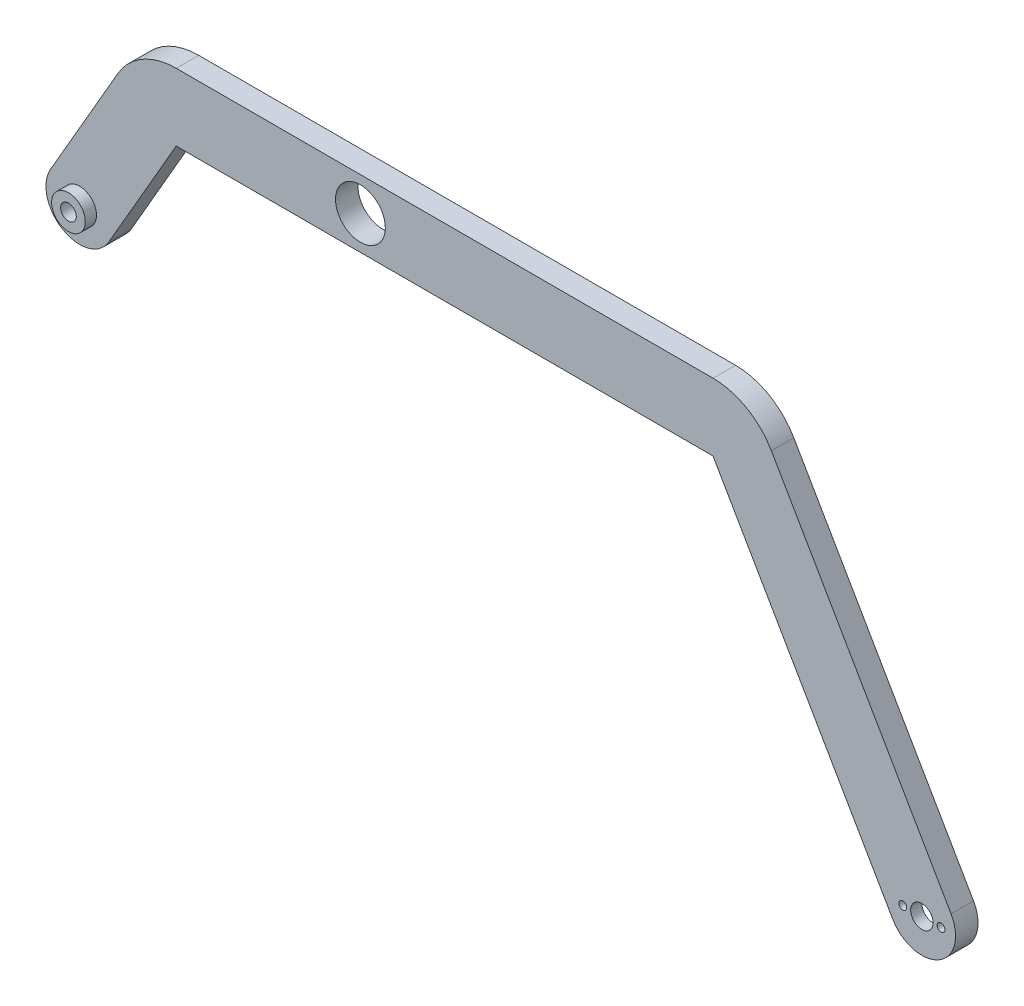
ISO-10303-21;
HEADER;
FILE_DESCRIPTION(('STEP AP214'),'2;1');
FILE_NAME('part.step','',(''),(''),'','','');
FILE_SCHEMA(('AUTOMOTIVE_DESIGN { 1 0 10303 214 1 1 1 1 }'));
ENDSEC;
DATA;
#1=APPLICATION_CONTEXT('core data for automotive mechanical design processes');
#2=APPLICATION_PROTOCOL_DEFINITION('international standard','automotive_design',2000,#1);
#3=PRODUCT_CONTEXT('',#1,'mechanical');
#4=PRODUCT('Part','Part','',(#3));
#5=PRODUCT_RELATED_PRODUCT_CATEGORY('part','',(#4));
#6=PRODUCT_DEFINITION_FORMATION('','',#4);
#7=PRODUCT_DEFINITION_CONTEXT('part definition',#1,'design');
#8=PRODUCT_DEFINITION('design','',#6,#7);
#9=PRODUCT_DEFINITION_SHAPE('','',#8);
#10=(LENGTH_UNIT() NAMED_UNIT(*) SI_UNIT(.MILLI.,.METRE.));
#11=(NAMED_UNIT(*) PLANE_ANGLE_UNIT() SI_UNIT($,.RADIAN.));
#12=(NAMED_UNIT(*) SI_UNIT($,.STERADIAN.) SOLID_ANGLE_UNIT());
#13=UNCERTAINTY_MEASURE_WITH_UNIT(LENGTH_MEASURE(1.E-05),#10,'distance_accuracy_value','');
#14=(GEOMETRIC_REPRESENTATION_CONTEXT(3) GLOBAL_UNCERTAINTY_ASSIGNED_CONTEXT((#13)) GLOBAL_UNIT_ASSIGNED_CONTEXT((#10,
#11,#12)) REPRESENTATION_CONTEXT('',''));
#15=CARTESIAN_POINT('',(0.,0.,0.));
#16=DIRECTION('',(0.,0.,1.));
#17=DIRECTION('',(1.,0.,0.));
#18=AXIS2_PLACEMENT_3D('',#15,#16,#17);
#19=CARTESIAN_POINT('',(258.499974642121,-146.043302059951,10.));
#20=DIRECTION('',(0.,0.,-1.));
#21=DIRECTION('',(-1.,0.,0.));
#22=AXIS2_PLACEMENT_3D('',#19,#20,#21);
#23=CYLINDRICAL_SURFACE('',#22,1.74999999999998);
#24=CARTESIAN_POINT('',(258.499974642121,-146.043302059951,10.));
#25=DIRECTION('',(0.,0.,1.));
#26=DIRECTION('',(1.,0.,0.));
#27=AXIS2_PLACEMENT_3D('',#24,#25,#26);
#28=CIRCLE('',#27,1.74999999999998);
#29=CARTESIAN_POINT('',(260.249974642121,-146.043302059951,10.));
#30=VERTEX_POINT('',#29);
#31=EDGE_CURVE('E163',#30,#30,#28,.T.);
#32=ORIENTED_EDGE('',*,*,#31,.T.);
#33=EDGE_LOOP('',(#32));
#34=FACE_BOUND('',#33,.T.);
#35=CARTESIAN_POINT('',(258.499974642121,-146.043302059951,5.));
#36=DIRECTION('',(0.,0.,-1.));
#37=DIRECTION('',(-1.,0.,0.));
#38=AXIS2_PLACEMENT_3D('',#35,#36,#37);
#39=CIRCLE('',#38,1.74999999999998);
#40=CARTESIAN_POINT('',(256.749974642121,-146.043302059951,5.));
#41=VERTEX_POINT('',#40);
#42=EDGE_CURVE('E204',#41,#41,#39,.T.);
#43=ORIENTED_EDGE('',*,*,#42,.T.);
#44=EDGE_LOOP('',(#43));
#45=FACE_BOUND('',#44,.T.);
#46=ADVANCED_FACE('F45',(#34,#45),#23,.F.);
#47=CARTESIAN_POINT('',(241.500025357879,-146.084827151071,10.));
#48=DIRECTION('',(0.,0.,-1.));
#49=DIRECTION('',(-1.,0.,0.));
#50=AXIS2_PLACEMENT_3D('',#47,#48,#49);
#51=CYLINDRICAL_SURFACE('',#50,1.75000000000004);
#52=CARTESIAN_POINT('',(241.500025357879,-146.084827151071,10.));
#53=DIRECTION('',(0.,0.,1.));
#54=DIRECTION('',(1.,0.,0.));
#55=AXIS2_PLACEMENT_3D('',#52,#53,#54);
#56=CIRCLE('',#55,1.75000000000004);
#57=CARTESIAN_POINT('',(243.250025357879,-146.084827151071,10.));
#58=VERTEX_POINT('',#57);
#59=EDGE_CURVE('E222',#58,#58,#56,.T.);
#60=ORIENTED_EDGE('',*,*,#59,.T.);
#61=EDGE_LOOP('',(#60));
#62=FACE_BOUND('',#61,.T.);
#63=CARTESIAN_POINT('',(241.500025357879,-146.084827151071,5.));
#64=DIRECTION('',(0.,0.,-1.));
#65=DIRECTION('',(-1.,0.,0.));
#66=AXIS2_PLACEMENT_3D('',#63,#64,#65);
#67=CIRCLE('',#66,1.75000000000004);
#68=CARTESIAN_POINT('',(239.750025357879,-146.084827151071,5.));
#69=VERTEX_POINT('',#68);
#70=EDGE_CURVE('E199',#69,#69,#67,.T.);
#71=ORIENTED_EDGE('',*,*,#70,.T.);
#72=EDGE_LOOP('',(#71));
#73=FACE_BOUND('',#72,.T.);
#74=ADVANCED_FACE('F278',(#62,#73),#51,.F.);
#75=CARTESIAN_POINT('',(250.,-146.064064605511,-31.3601857456234));
#76=DIRECTION('',(0.,0.,1.));
#77=DIRECTION('',(1.,0.,0.));
#78=AXIS2_PLACEMENT_3D('',#75,#76,#77);
#79=CYLINDRICAL_SURFACE('',#78,4.99999999999999);
#80=CARTESIAN_POINT('',(250.,-146.064064605511,10.));
#81=DIRECTION('',(0.,0.,1.));
#82=DIRECTION('',(1.,0.,0.));
#83=AXIS2_PLACEMENT_3D('',#80,#81,#82);
#84=CIRCLE('',#83,4.99999999999999);
#85=CARTESIAN_POINT('',(255.,-146.064064605511,10.));
#86=VERTEX_POINT('',#85);
#87=EDGE_CURVE('E219',#86,#86,#84,.T.);
#88=ORIENTED_EDGE('',*,*,#87,.T.);
#89=EDGE_LOOP('',(#88));
#90=FACE_BOUND('',#89,.T.);
#91=CARTESIAN_POINT('',(250.,-146.064064605511,5.));
#92=DIRECTION('',(0.,0.,-1.));
#93=DIRECTION('',(-1.,0.,0.));
#94=AXIS2_PLACEMENT_3D('',#91,#92,#93);
#95=CIRCLE('',#94,4.99999999999999);
#96=CARTESIAN_POINT('',(245.,-146.064064605511,5.));
#97=VERTEX_POINT('',#96);
#98=EDGE_CURVE('E197',#97,#97,#95,.F.);
#99=ORIENTED_EDGE('',*,*,#98,.F.);
#100=EDGE_LOOP('',(#99));
#101=FACE_BOUND('',#100,.T.);
#102=ADVANCED_FACE('F284',(#90,#101),#79,.F.);
#103=CARTESIAN_POINT('',(-82.0096189432334,-15.,10.));
#104=DIRECTION('',(0.,0.,-1.));
#105=DIRECTION('',(-1.,0.,0.));
#106=AXIS2_PLACEMENT_3D('',#103,#104,#105);
#107=PLANE('',#106);
#108=CARTESIAN_POINT('',(-125.,-59.4615242270661,10.));
#109=DIRECTION('',(0.,0.,-1.));
#110=DIRECTION('',(-1.,0.,0.));
#111=AXIS2_PLACEMENT_3D('',#108,#109,#110);
#112=CIRCLE('',#111,7.50000000000001);
#113=CARTESIAN_POINT('',(-132.5,-59.4615242270661,10.));
#114=VERTEX_POINT('',#113);
#115=EDGE_CURVE('E12',#114,#114,#112,.F.);
#116=ORIENTED_EDGE('',*,*,#115,.F.);
#117=EDGE_LOOP('',(#116));
#118=FACE_BOUND('',#117,.T.);
#119=ORIENTED_EDGE('',*,*,#87,.F.);
#120=EDGE_LOOP('',(#119));
#121=FACE_BOUND('',#120,.T.);
#122=CARTESIAN_POINT('',(0.,0.,10.));
#123=DIRECTION('',(0.,0.,1.));
#124=DIRECTION('',(1.,0.,0.));
#125=AXIS2_PLACEMENT_3D('',#122,#123,#124);
#126=CIRCLE('',#125,11.0875);
#127=CARTESIAN_POINT('',(11.0875,0.,10.));
#128=VERTEX_POINT('',#127);
#129=EDGE_CURVE('E223',#128,#128,#126,.T.);
#130=ORIENTED_EDGE('',*,*,#129,.F.);
#131=EDGE_LOOP('',(#130));
#132=FACE_BOUND('',#131,.T.);
#133=DIRECTION('',(-1.,0.,0.));
#134=VECTOR('',#133,1.);
#135=CARTESIAN_POINT('',(0.,15.,10.));
#136=LINE('',#135,#134);
#137=CARTESIAN_POINT('',(157.009618943233,15.,10.));
#138=VERTEX_POINT('',#137);
#139=CARTESIAN_POINT('',(-82.0096189432334,15.,10.));
#140=VERTEX_POINT('',#139);
#141=EDGE_CURVE('E62',#138,#140,#136,.T.);
#142=ORIENTED_EDGE('',*,*,#141,.T.);
#143=CARTESIAN_POINT('',(-82.0096189432334,-15.,10.));
#144=DIRECTION('',(0.,0.,1.));
#145=DIRECTION('',(-1.,0.,0.));
#146=AXIS2_PLACEMENT_3D('',#143,#144,#145);
#147=CIRCLE('',#146,30.);
#148=CARTESIAN_POINT('',(-107.990381056767,0.,10.));
#149=VERTEX_POINT('',#148);
#150=EDGE_CURVE('E113',#140,#149,#147,.T.);
#151=ORIENTED_EDGE('',*,*,#150,.T.);
#152=DIRECTION('',(-0.5,-0.866025403784438,0.));
#153=VECTOR('',#152,1.);
#154=CARTESIAN_POINT('',(-137.990381056767,-51.9615242270663,10.));
#155=LINE('',#154,#153);
#156=CARTESIAN_POINT('',(-137.990381056766,-51.9615242270664,10.));
#157=VERTEX_POINT('',#156);
#158=EDGE_CURVE('E234',#149,#157,#155,.T.);
#159=ORIENTED_EDGE('',*,*,#158,.T.);
#160=CARTESIAN_POINT('',(-125.,-59.4615242270666,10.));
#161=DIRECTION('',(0.,0.,1.));
#162=DIRECTION('',(1.,0.,0.));
#163=AXIS2_PLACEMENT_3D('',#160,#161,#162);
#164=CIRCLE('',#163,15.);
#165=CARTESIAN_POINT('',(-112.009618943233,-66.9615242270663,10.));
#166=VERTEX_POINT('',#165);
#167=EDGE_CURVE('E236',#157,#166,#164,.T.);
#168=ORIENTED_EDGE('',*,*,#167,.T.);
#169=DIRECTION('',(0.5,0.866025403784438,0.));
#170=VECTOR('',#169,1.);
#171=CARTESIAN_POINT('',(-82.0096189432334,-15.,10.));
#172=LINE('',#171,#170);
#173=CARTESIAN_POINT('',(-82.0096189432334,-15.,10.));
#174=VERTEX_POINT('',#173);
#175=EDGE_CURVE('E238',#166,#174,#172,.T.);
#176=ORIENTED_EDGE('',*,*,#175,.T.);
#177=DIRECTION('',(1.,0.,0.));
#178=VECTOR('',#177,1.);
#179=CARTESIAN_POINT('',(0.,-15.,10.));
#180=LINE('',#179,#178);
#181=CARTESIAN_POINT('',(157.009618943233,-15.,10.));
#182=VERTEX_POINT('',#181);
#183=EDGE_CURVE('E240',#174,#182,#180,.T.);
#184=ORIENTED_EDGE('',*,*,#183,.T.);
#185=DIRECTION('',(0.5,-0.866025403784439,0.));
#186=VECTOR('',#185,1.);
#187=CARTESIAN_POINT('',(157.009618943233,-15.,10.));
#188=LINE('',#187,#186);
#189=CARTESIAN_POINT('',(237.009618943233,-153.564064605511,10.));
#190=VERTEX_POINT('',#189);
#191=EDGE_CURVE('E140',#182,#190,#188,.T.);
#192=ORIENTED_EDGE('',*,*,#191,.T.);
#193=CARTESIAN_POINT('',(250.,-146.064064605511,10.));
#194=DIRECTION('',(0.,0.,1.));
#195=DIRECTION('',(1.,0.,0.));
#196=AXIS2_PLACEMENT_3D('',#193,#194,#195);
#197=CIRCLE('',#196,15.);
#198=CARTESIAN_POINT('',(262.990381056767,-138.564064605511,10.));
#199=VERTEX_POINT('',#198);
#200=EDGE_CURVE('E133',#190,#199,#197,.T.);
#201=ORIENTED_EDGE('',*,*,#200,.T.);
#202=DIRECTION('',(-0.5,0.866025403784438,0.));
#203=VECTOR('',#202,1.);
#204=CARTESIAN_POINT('',(262.990381056767,-138.564064605511,10.));
#205=LINE('',#204,#203);
#206=CARTESIAN_POINT('',(182.990381056766,0.,10.));
#207=VERTEX_POINT('',#206);
#208=EDGE_CURVE('E138',#199,#207,#205,.T.);
#209=ORIENTED_EDGE('',*,*,#208,.T.);
#210=CARTESIAN_POINT('',(157.009618943233,-15.,10.));
#211=DIRECTION('',(0.,0.,1.));
#212=DIRECTION('',(1.,0.,0.));
#213=AXIS2_PLACEMENT_3D('',#210,#211,#212);
#214=CIRCLE('',#213,30.);
#215=EDGE_CURVE('E154',#207,#138,#214,.T.);
#216=ORIENTED_EDGE('',*,*,#215,.T.);
#217=EDGE_LOOP('',(#142,#151,#159,#168,#176,#184,#192,#201,#209,#216));
#218=FACE_BOUND('',#217,.T.);
#219=ORIENTED_EDGE('',*,*,#31,.F.);
#220=EDGE_LOOP('',(#219));
#221=FACE_BOUND('',#220,.T.);
#222=ORIENTED_EDGE('',*,*,#59,.F.);
#223=EDGE_LOOP('',(#222));
#224=FACE_BOUND('',#223,.T.);
#225=ADVANCED_FACE('F135',(#118,#121,#132,#218,#221,#224),#107,.F.);
#226=CARTESIAN_POINT('',(-82.0096189432334,-15.,0.));
#227=DIRECTION('',(0.,0.,-1.));
#228=DIRECTION('',(-1.,0.,0.));
#229=AXIS2_PLACEMENT_3D('',#226,#227,#228);
#230=PLANE('',#229);
#231=CARTESIAN_POINT('',(-125.,-59.4615242270661,0.));
#232=DIRECTION('',(0.,0.,1.));
#233=DIRECTION('',(1.,0.,0.));
#234=AXIS2_PLACEMENT_3D('',#231,#232,#233);
#235=CIRCLE('',#234,3.50000000000001);
#236=CARTESIAN_POINT('',(-121.5,-59.4615242270661,0.));
#237=VERTEX_POINT('',#236);
#238=EDGE_CURVE('E513',#237,#237,#235,.T.);
#239=ORIENTED_EDGE('',*,*,#238,.T.);
#240=EDGE_LOOP('',(#239));
#241=FACE_BOUND('',#240,.T.);
#242=CARTESIAN_POINT('',(250.,-146.064064605511,0.));
#243=DIRECTION('',(0.,0.,-1.));
#244=DIRECTION('',(-1.,0.,0.));
#245=AXIS2_PLACEMENT_3D('',#242,#243,#244);
#246=CIRCLE('',#245,13.);
#247=CARTESIAN_POINT('',(237.,-146.064064605511,0.));
#248=VERTEX_POINT('',#247);
#249=EDGE_CURVE('E207',#248,#248,#246,.T.);
#250=ORIENTED_EDGE('',*,*,#249,.F.);
#251=EDGE_LOOP('',(#250));
#252=FACE_BOUND('',#251,.T.);
#253=CARTESIAN_POINT('',(0.,0.,0.));
#254=DIRECTION('',(0.,0.,-1.));
#255=DIRECTION('',(-1.,0.,0.));
#256=AXIS2_PLACEMENT_3D('',#253,#254,#255);
#257=CIRCLE('',#256,11.0875);
#258=CARTESIAN_POINT('',(-11.0875,0.,0.));
#259=VERTEX_POINT('',#258);
#260=EDGE_CURVE('E218',#259,#259,#257,.F.);
#261=ORIENTED_EDGE('',*,*,#260,.T.);
#262=EDGE_LOOP('',(#261));
#263=FACE_BOUND('',#262,.T.);
#264=CARTESIAN_POINT('',(-82.0096189432334,-15.,0.));
#265=DIRECTION('',(0.,0.,1.));
#266=DIRECTION('',(-1.,0.,0.));
#267=AXIS2_PLACEMENT_3D('',#264,#265,#266);
#268=CIRCLE('',#267,30.);
#269=CARTESIAN_POINT('',(-82.0096189432334,15.,0.));
#270=VERTEX_POINT('',#269);
#271=CARTESIAN_POINT('',(-107.990381056767,0.,0.));
#272=VERTEX_POINT('',#271);
#273=EDGE_CURVE('E160',#270,#272,#268,.T.);
#274=ORIENTED_EDGE('',*,*,#273,.F.);
#275=DIRECTION('',(-1.,0.,0.));
#276=VECTOR('',#275,1.);
#277=CARTESIAN_POINT('',(0.,15.,0.));
#278=LINE('',#277,#276);
#279=CARTESIAN_POINT('',(157.009618943233,15.,0.));
#280=VERTEX_POINT('',#279);
#281=EDGE_CURVE('E177',#280,#270,#278,.T.);
#282=ORIENTED_EDGE('',*,*,#281,.F.);
#283=CARTESIAN_POINT('',(157.009618943233,-15.,0.));
#284=DIRECTION('',(0.,0.,1.));
#285=DIRECTION('',(1.,0.,0.));
#286=AXIS2_PLACEMENT_3D('',#283,#284,#285);
#287=CIRCLE('',#286,30.);
#288=CARTESIAN_POINT('',(182.990381056766,0.,0.));
#289=VERTEX_POINT('',#288);
#290=EDGE_CURVE('E105',#289,#280,#287,.T.);
#291=ORIENTED_EDGE('',*,*,#290,.F.);
#292=DIRECTION('',(-0.5,0.866025403784438,0.));
#293=VECTOR('',#292,1.);
#294=CARTESIAN_POINT('',(262.990381056767,-138.564064605511,0.));
#295=LINE('',#294,#293);
#296=CARTESIAN_POINT('',(262.990381056767,-138.564064605511,0.));
#297=VERTEX_POINT('',#296);
#298=EDGE_CURVE('E98',#297,#289,#295,.T.);
#299=ORIENTED_EDGE('',*,*,#298,.F.);
#300=CARTESIAN_POINT('',(250.,-146.064064605511,0.));
#301=DIRECTION('',(0.,0.,1.));
#302=DIRECTION('',(1.,0.,0.));
#303=AXIS2_PLACEMENT_3D('',#300,#301,#302);
#304=CIRCLE('',#303,15.);
#305=CARTESIAN_POINT('',(237.009618943233,-153.564064605511,0.));
#306=VERTEX_POINT('',#305);
#307=EDGE_CURVE('E148',#306,#297,#304,.T.);
#308=ORIENTED_EDGE('',*,*,#307,.F.);
#309=DIRECTION('',(0.5,-0.866025403784439,0.));
#310=VECTOR('',#309,1.);
#311=CARTESIAN_POINT('',(157.009618943233,-15.,0.));
#312=LINE('',#311,#310);
#313=CARTESIAN_POINT('',(157.009618943233,-15.,0.));
#314=VERTEX_POINT('',#313);
#315=EDGE_CURVE('E172',#314,#306,#312,.T.);
#316=ORIENTED_EDGE('',*,*,#315,.F.);
#317=DIRECTION('',(1.,0.,0.));
#318=VECTOR('',#317,1.);
#319=CARTESIAN_POINT('',(0.,-15.,0.));
#320=LINE('',#319,#318);
#321=CARTESIAN_POINT('',(-82.0096189432334,-15.,0.));
#322=VERTEX_POINT('',#321);
#323=EDGE_CURVE('E170',#322,#314,#320,.T.);
#324=ORIENTED_EDGE('',*,*,#323,.F.);
#325=DIRECTION('',(0.5,0.866025403784438,0.));
#326=VECTOR('',#325,1.);
#327=CARTESIAN_POINT('',(-82.0096189432334,-15.,0.));
#328=LINE('',#327,#326);
#329=CARTESIAN_POINT('',(-112.009618943233,-66.9615242270663,0.));
#330=VERTEX_POINT('',#329);
#331=EDGE_CURVE('E167',#330,#322,#328,.T.);
#332=ORIENTED_EDGE('',*,*,#331,.F.);
#333=CARTESIAN_POINT('',(-125.,-59.4615242270666,0.));
#334=DIRECTION('',(0.,0.,1.));
#335=DIRECTION('',(1.,0.,0.));
#336=AXIS2_PLACEMENT_3D('',#333,#334,#335);
#337=CIRCLE('',#336,15.);
#338=CARTESIAN_POINT('',(-137.990381056766,-51.9615242270664,0.));
#339=VERTEX_POINT('',#338);
#340=EDGE_CURVE('E165',#339,#330,#337,.T.);
#341=ORIENTED_EDGE('',*,*,#340,.F.);
#342=DIRECTION('',(-0.5,-0.866025403784438,0.));
#343=VECTOR('',#342,1.);
#344=CARTESIAN_POINT('',(-137.990381056767,-51.9615242270663,0.));
#345=LINE('',#344,#343);
#346=EDGE_CURVE('E162',#272,#339,#345,.T.);
#347=ORIENTED_EDGE('',*,*,#346,.F.);
#348=EDGE_LOOP('',(#274,#282,#291,#299,#308,#316,#324,#332,#341,#347));
#349=FACE_BOUND('',#348,.T.);
#350=ADVANCED_FACE('F252',(#241,#252,#263,#349),#230,.T.);
#351=CARTESIAN_POINT('',(-82.0096189432334,-15.,10.));
#352=DIRECTION('',(0.,0.,-1.));
#353=DIRECTION('',(-1.,0.,0.));
#354=AXIS2_PLACEMENT_3D('',#351,#352,#353);
#355=CYLINDRICAL_SURFACE('',#354,30.);
#356=ORIENTED_EDGE('',*,*,#273,.T.);
#357=DIRECTION('',(0.,0.,-1.));
#358=VECTOR('',#357,1.);
#359=CARTESIAN_POINT('',(-107.990381056767,0.,10.));
#360=LINE('',#359,#358);
#361=EDGE_CURVE('E194',#149,#272,#360,.T.);
#362=ORIENTED_EDGE('',*,*,#361,.F.);
#363=ORIENTED_EDGE('',*,*,#150,.F.);
#364=DIRECTION('',(0.,0.,-1.));
#365=VECTOR('',#364,1.);
#366=CARTESIAN_POINT('',(-82.0096189432334,15.,10.));
#367=LINE('',#366,#365);
#368=EDGE_CURVE('E54',#140,#270,#367,.T.);
#369=ORIENTED_EDGE('',*,*,#368,.T.);
#370=EDGE_LOOP('',(#356,#362,#363,#369));
#371=FACE_BOUND('',#370,.T.);
#372=ADVANCED_FACE('F47',(#371),#355,.T.);
#373=CARTESIAN_POINT('',(-137.990381056767,-51.9615242270663,10.));
#374=DIRECTION('',(0.866025403784438,-0.5,0.));
#375=DIRECTION('',(0.5,0.866025403784438,0.));
#376=AXIS2_PLACEMENT_3D('',#373,#374,#375);
#377=PLANE('',#376);
#378=ORIENTED_EDGE('',*,*,#346,.T.);
#379=DIRECTION('',(0.,0.,-1.));
#380=VECTOR('',#379,1.);
#381=CARTESIAN_POINT('',(-137.990381056766,-51.9615242270664,10.));
#382=LINE('',#381,#380);
#383=EDGE_CURVE('E191',#157,#339,#382,.T.);
#384=ORIENTED_EDGE('',*,*,#383,.F.);
#385=ORIENTED_EDGE('',*,*,#158,.F.);
#386=ORIENTED_EDGE('',*,*,#361,.T.);
#387=EDGE_LOOP('',(#378,#384,#385,#386));
#388=FACE_BOUND('',#387,.T.);
#389=ADVANCED_FACE('F260',(#388),#377,.F.);
#390=CARTESIAN_POINT('',(-125.,-59.4615242270666,10.));
#391=DIRECTION('',(0.,0.,-1.));
#392=DIRECTION('',(-1.,0.,0.));
#393=AXIS2_PLACEMENT_3D('',#390,#391,#392);
#394=CYLINDRICAL_SURFACE('',#393,15.);
#395=ORIENTED_EDGE('',*,*,#340,.T.);
#396=DIRECTION('',(0.,0.,-1.));
#397=VECTOR('',#396,1.);
#398=CARTESIAN_POINT('',(-112.009618943233,-66.9615242270663,10.));
#399=LINE('',#398,#397);
#400=EDGE_CURVE('E188',#166,#330,#399,.T.);
#401=ORIENTED_EDGE('',*,*,#400,.F.);
#402=ORIENTED_EDGE('',*,*,#167,.F.);
#403=ORIENTED_EDGE('',*,*,#383,.T.);
#404=EDGE_LOOP('',(#395,#401,#402,#403));
#405=FACE_BOUND('',#404,.T.);
#406=ADVANCED_FACE('F265',(#405),#394,.T.);
#407=CARTESIAN_POINT('',(-82.0096189432334,-15.,10.));
#408=DIRECTION('',(-0.866025403784439,0.5,0.));
#409=DIRECTION('',(-0.5,-0.866025403784439,0.));
#410=AXIS2_PLACEMENT_3D('',#407,#408,#409);
#411=PLANE('',#410);
#412=ORIENTED_EDGE('',*,*,#331,.T.);
#413=DIRECTION('',(0.,0.,-1.));
#414=VECTOR('',#413,1.);
#415=CARTESIAN_POINT('',(-82.0096189432334,-15.,10.));
#416=LINE('',#415,#414);
#417=EDGE_CURVE('E185',#174,#322,#416,.T.);
#418=ORIENTED_EDGE('',*,*,#417,.F.);
#419=ORIENTED_EDGE('',*,*,#175,.F.);
#420=ORIENTED_EDGE('',*,*,#400,.T.);
#421=EDGE_LOOP('',(#412,#418,#419,#420));
#422=FACE_BOUND('',#421,.T.);
#423=ADVANCED_FACE('F268',(#422),#411,.F.);
#424=CARTESIAN_POINT('',(0.,-15.,10.));
#425=DIRECTION('',(0.,1.,0.));
#426=DIRECTION('',(-1.,0.,0.));
#427=AXIS2_PLACEMENT_3D('',#424,#425,#426);
#428=PLANE('',#427);
#429=ORIENTED_EDGE('',*,*,#323,.T.);
#430=DIRECTION('',(0.,0.,-1.));
#431=VECTOR('',#430,1.);
#432=CARTESIAN_POINT('',(157.009618943233,-15.,10.));
#433=LINE('',#432,#431);
#434=EDGE_CURVE('E182',#182,#314,#433,.T.);
#435=ORIENTED_EDGE('',*,*,#434,.F.);
#436=ORIENTED_EDGE('',*,*,#183,.F.);
#437=ORIENTED_EDGE('',*,*,#417,.T.);
#438=EDGE_LOOP('',(#429,#435,#436,#437));
#439=FACE_BOUND('',#438,.T.);
#440=ADVANCED_FACE('F246',(#439),#428,.F.);
#441=CARTESIAN_POINT('',(157.009618943233,-15.,10.));
#442=DIRECTION('',(0.866025403784439,0.5,0.));
#443=DIRECTION('',(-0.5,0.866025403784439,0.));
#444=AXIS2_PLACEMENT_3D('',#441,#442,#443);
#445=PLANE('',#444);
#446=ORIENTED_EDGE('',*,*,#315,.T.);
#447=DIRECTION('',(0.,0.,-1.));
#448=VECTOR('',#447,1.);
#449=CARTESIAN_POINT('',(237.009618943233,-153.564064605511,10.));
#450=LINE('',#449,#448);
#451=EDGE_CURVE('E149',#190,#306,#450,.T.);
#452=ORIENTED_EDGE('',*,*,#451,.F.);
#453=ORIENTED_EDGE('',*,*,#191,.F.);
#454=ORIENTED_EDGE('',*,*,#434,.T.);
#455=EDGE_LOOP('',(#446,#452,#453,#454));
#456=FACE_BOUND('',#455,.T.);
#457=ADVANCED_FACE('F249',(#456),#445,.F.);
#458=CARTESIAN_POINT('',(250.,-146.064064605511,10.));
#459=DIRECTION('',(0.,0.,-1.));
#460=DIRECTION('',(-1.,0.,0.));
#461=AXIS2_PLACEMENT_3D('',#458,#459,#460);
#462=CYLINDRICAL_SURFACE('',#461,15.);
#463=ORIENTED_EDGE('',*,*,#307,.T.);
#464=DIRECTION('',(0.,0.,-1.));
#465=VECTOR('',#464,1.);
#466=CARTESIAN_POINT('',(262.990381056767,-138.564064605511,10.));
#467=LINE('',#466,#465);
#468=EDGE_CURVE('E145',#199,#297,#467,.T.);
#469=ORIENTED_EDGE('',*,*,#468,.F.);
#470=ORIENTED_EDGE('',*,*,#200,.F.);
#471=ORIENTED_EDGE('',*,*,#451,.T.);
#472=EDGE_LOOP('',(#463,#469,#470,#471));
#473=FACE_BOUND('',#472,.T.);
#474=ADVANCED_FACE('F146',(#473),#462,.T.);
#475=CARTESIAN_POINT('',(262.990381056767,-138.564064605511,10.));
#476=DIRECTION('',(-0.866025403784438,-0.5,0.));
#477=DIRECTION('',(0.5,-0.866025403784439,0.));
#478=AXIS2_PLACEMENT_3D('',#475,#476,#477);
#479=PLANE('',#478);
#480=ORIENTED_EDGE('',*,*,#298,.T.);
#481=DIRECTION('',(0.,0.,-1.));
#482=VECTOR('',#481,1.);
#483=CARTESIAN_POINT('',(182.990381056766,0.,10.));
#484=LINE('',#483,#482);
#485=EDGE_CURVE('E150',#207,#289,#484,.T.);
#486=ORIENTED_EDGE('',*,*,#485,.F.);
#487=ORIENTED_EDGE('',*,*,#208,.F.);
#488=ORIENTED_EDGE('',*,*,#468,.T.);
#489=EDGE_LOOP('',(#480,#486,#487,#488));
#490=FACE_BOUND('',#489,.T.);
#491=ADVANCED_FACE('F152',(#490),#479,.F.);
#492=CARTESIAN_POINT('',(157.009618943233,-15.,10.));
#493=DIRECTION('',(0.,0.,-1.));
#494=DIRECTION('',(-1.,0.,0.));
#495=AXIS2_PLACEMENT_3D('',#492,#493,#494);
#496=CYLINDRICAL_SURFACE('',#495,30.);
#497=ORIENTED_EDGE('',*,*,#290,.T.);
#498=DIRECTION('',(0.,0.,-1.));
#499=VECTOR('',#498,1.);
#500=CARTESIAN_POINT('',(157.009618943233,15.,10.));
#501=LINE('',#500,#499);
#502=EDGE_CURVE('E156',#138,#280,#501,.T.);
#503=ORIENTED_EDGE('',*,*,#502,.F.);
#504=ORIENTED_EDGE('',*,*,#215,.F.);
#505=ORIENTED_EDGE('',*,*,#485,.T.);
#506=EDGE_LOOP('',(#497,#503,#504,#505));
#507=FACE_BOUND('',#506,.T.);
#508=ADVANCED_FACE('F256',(#507),#496,.T.);
#509=CARTESIAN_POINT('',(0.,15.,10.));
#510=DIRECTION('',(0.,-1.,0.));
#511=DIRECTION('',(1.,0.,0.));
#512=AXIS2_PLACEMENT_3D('',#509,#510,#511);
#513=PLANE('',#512);
#514=ORIENTED_EDGE('',*,*,#281,.T.);
#515=ORIENTED_EDGE('',*,*,#368,.F.);
#516=ORIENTED_EDGE('',*,*,#141,.F.);
#517=ORIENTED_EDGE('',*,*,#502,.T.);
#518=EDGE_LOOP('',(#514,#515,#516,#517));
#519=FACE_BOUND('',#518,.T.);
#520=ADVANCED_FACE('F255',(#519),#513,.F.);
#521=CARTESIAN_POINT('',(0.,0.,-31.3601857456234));
#522=DIRECTION('',(0.,0.,1.));
#523=DIRECTION('',(1.,0.,0.));
#524=AXIS2_PLACEMENT_3D('',#521,#522,#523);
#525=CYLINDRICAL_SURFACE('',#524,11.0875);
#526=ORIENTED_EDGE('',*,*,#129,.T.);
#527=EDGE_LOOP('',(#526));
#528=FACE_BOUND('',#527,.T.);
#529=ORIENTED_EDGE('',*,*,#260,.F.);
#530=EDGE_LOOP('',(#529));
#531=FACE_BOUND('',#530,.T.);
#532=ADVANCED_FACE('F298',(#528,#531),#525,.F.);
#533=CARTESIAN_POINT('',(-82.0096189432334,-15.,5.));
#534=DIRECTION('',(0.,0.,-1.));
#535=DIRECTION('',(-1.,0.,0.));
#536=AXIS2_PLACEMENT_3D('',#533,#534,#535);
#537=PLANE('',#536);
#538=ORIENTED_EDGE('',*,*,#42,.F.);
#539=EDGE_LOOP('',(#538));
#540=FACE_BOUND('',#539,.T.);
#541=ORIENTED_EDGE('',*,*,#70,.F.);
#542=EDGE_LOOP('',(#541));
#543=FACE_BOUND('',#542,.T.);
#544=CARTESIAN_POINT('',(250.,-146.064064605511,5.));
#545=DIRECTION('',(0.,0.,-1.));
#546=DIRECTION('',(-1.,0.,0.));
#547=AXIS2_PLACEMENT_3D('',#544,#545,#546);
#548=CIRCLE('',#547,13.);
#549=CARTESIAN_POINT('',(237.,-146.064064605511,5.));
#550=VERTEX_POINT('',#549);
#551=EDGE_CURVE('E200',#550,#550,#548,.F.);
#552=ORIENTED_EDGE('',*,*,#551,.F.);
#553=EDGE_LOOP('',(#552));
#554=FACE_BOUND('',#553,.T.);
#555=ORIENTED_EDGE('',*,*,#98,.T.);
#556=EDGE_LOOP('',(#555));
#557=FACE_BOUND('',#556,.T.);
#558=ADVANCED_FACE('F332',(#540,#543,#554,#557),#537,.T.);
#559=CARTESIAN_POINT('',(250.,-146.064064605511,46.7695526217005));
#560=DIRECTION('',(0.,0.,-1.));
#561=DIRECTION('',(-1.,0.,0.));
#562=AXIS2_PLACEMENT_3D('',#559,#560,#561);
#563=CYLINDRICAL_SURFACE('',#562,13.);
#564=ORIENTED_EDGE('',*,*,#551,.T.);
#565=EDGE_LOOP('',(#564));
#566=FACE_BOUND('',#565,.T.);
#567=ORIENTED_EDGE('',*,*,#249,.T.);
#568=EDGE_LOOP('',(#567));
#569=FACE_BOUND('',#568,.T.);
#570=ADVANCED_FACE('F339',(#566,#569),#563,.F.);
#571=CARTESIAN_POINT('',(-125.,-59.4615242270661,15.));
#572=DIRECTION('',(0.,0.,-1.));
#573=DIRECTION('',(-1.,0.,0.));
#574=AXIS2_PLACEMENT_3D('',#571,#572,#573);
#575=CYLINDRICAL_SURFACE('',#574,7.50000000000001);
#576=CARTESIAN_POINT('',(-125.,-59.4615242270661,15.));
#577=DIRECTION('',(0.,0.,1.));
#578=DIRECTION('',(1.,0.,0.));
#579=AXIS2_PLACEMENT_3D('',#576,#577,#578);
#580=CIRCLE('',#579,7.50000000000001);
#581=CARTESIAN_POINT('',(-117.5,-59.4615242270661,15.));
#582=VERTEX_POINT('',#581);
#583=EDGE_CURVE('E212',#582,#582,#580,.T.);
#584=ORIENTED_EDGE('',*,*,#583,.F.);
#585=EDGE_LOOP('',(#584));
#586=FACE_BOUND('',#585,.T.);
#587=ORIENTED_EDGE('',*,*,#115,.T.);
#588=EDGE_LOOP('',(#587));
#589=FACE_BOUND('',#588,.T.);
#590=ADVANCED_FACE('F348',(#586,#589),#575,.T.);
#591=CARTESIAN_POINT('',(-125.,-59.4615242270661,15.));
#592=DIRECTION('',(0.,0.,1.));
#593=DIRECTION('',(1.,0.,0.));
#594=AXIS2_PLACEMENT_3D('',#591,#592,#593);
#595=PLANE('',#594);
#596=CARTESIAN_POINT('',(-125.,-59.4615242270661,15.));
#597=DIRECTION('',(0.,0.,1.));
#598=DIRECTION('',(1.,0.,0.));
#599=AXIS2_PLACEMENT_3D('',#596,#597,#598);
#600=CIRCLE('',#599,3.50000000000001);
#601=CARTESIAN_POINT('',(-121.5,-59.4615242270661,15.));
#602=VERTEX_POINT('',#601);
#603=EDGE_CURVE('E516',#602,#602,#600,.T.);
#604=ORIENTED_EDGE('',*,*,#603,.F.);
#605=EDGE_LOOP('',(#604));
#606=FACE_BOUND('',#605,.T.);
#607=ORIENTED_EDGE('',*,*,#583,.T.);
#608=EDGE_LOOP('',(#607));
#609=FACE_BOUND('',#608,.T.);
#610=ADVANCED_FACE('F356',(#606,#609),#595,.T.);
#611=CARTESIAN_POINT('',(-125.,-59.4615242270661,0.));
#612=DIRECTION('',(0.,0.,1.));
#613=DIRECTION('',(1.,0.,0.));
#614=AXIS2_PLACEMENT_3D('',#611,#612,#613);
#615=CYLINDRICAL_SURFACE('',#614,3.50000000000001);
#616=ORIENTED_EDGE('',*,*,#238,.F.);
#617=EDGE_LOOP('',(#616));
#618=FACE_BOUND('',#617,.T.);
#619=ORIENTED_EDGE('',*,*,#603,.T.);
#620=EDGE_LOOP('',(#619));
#621=FACE_BOUND('',#620,.T.);
#622=ADVANCED_FACE('F365',(#618,#621),#615,.F.);
#623=CLOSED_SHELL('',(#46,#74,#102,#225,#350,#372,#389,#406,#423,#440,#457,#474,#491,#508,#520,
#532,#558,#570,#590,#610,#622));
#624=MANIFOLD_SOLID_BREP('B2',#623);
#625=ADVANCED_BREP_SHAPE_REPRESENTATION('',(#18,#624),#14);
#626=SHAPE_DEFINITION_REPRESENTATION(#9,#625);
ENDSEC;
END-ISO-10303-21;
